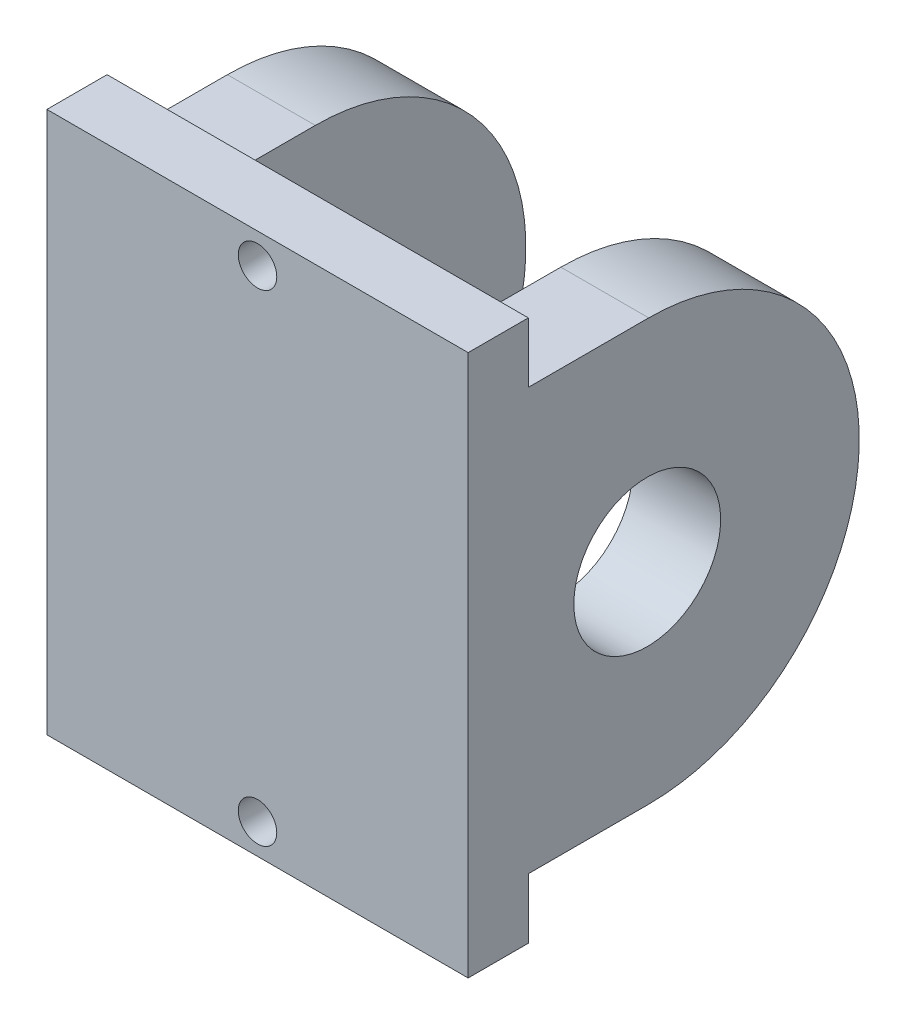
ISO-10303-21;
HEADER;
FILE_DESCRIPTION(('STEP AP214'),'2;1');
FILE_NAME('part.step','',(''),(''),'','','');
FILE_SCHEMA(('AUTOMOTIVE_DESIGN { 1 0 10303 214 1 1 1 1 }'));
ENDSEC;
DATA;
#1=APPLICATION_CONTEXT('core data for automotive mechanical design processes');
#2=APPLICATION_PROTOCOL_DEFINITION('international standard','automotive_design',2000,#1);
#3=PRODUCT_CONTEXT('',#1,'mechanical');
#4=PRODUCT('Part','Part','',(#3));
#5=PRODUCT_RELATED_PRODUCT_CATEGORY('part','',(#4));
#6=PRODUCT_DEFINITION_FORMATION('','',#4);
#7=PRODUCT_DEFINITION_CONTEXT('part definition',#1,'design');
#8=PRODUCT_DEFINITION('design','',#6,#7);
#9=PRODUCT_DEFINITION_SHAPE('','',#8);
#10=(LENGTH_UNIT() NAMED_UNIT(*) SI_UNIT(.MILLI.,.METRE.));
#11=(NAMED_UNIT(*) PLANE_ANGLE_UNIT() SI_UNIT($,.RADIAN.));
#12=(NAMED_UNIT(*) SI_UNIT($,.STERADIAN.) SOLID_ANGLE_UNIT());
#13=UNCERTAINTY_MEASURE_WITH_UNIT(LENGTH_MEASURE(1.E-05),#10,'distance_accuracy_value','');
#14=(GEOMETRIC_REPRESENTATION_CONTEXT(3) GLOBAL_UNCERTAINTY_ASSIGNED_CONTEXT((#13)) GLOBAL_UNIT_ASSIGNED_CONTEXT((#10,
#11,#12)) REPRESENTATION_CONTEXT('',''));
#15=CARTESIAN_POINT('',(0.,0.,0.));
#16=DIRECTION('',(0.,0.,1.));
#17=DIRECTION('',(1.,0.,0.));
#18=AXIS2_PLACEMENT_3D('',#15,#16,#17);
#19=CARTESIAN_POINT('',(-17.5,17.5,5.));
#20=DIRECTION('',(0.,-1.,0.));
#21=DIRECTION('',(0.,0.,-1.));
#22=AXIS2_PLACEMENT_3D('',#19,#20,#21);
#23=PLANE('',#22);
#24=DIRECTION('',(-1.,0.,0.));
#25=VECTOR('',#24,1.);
#26=CARTESIAN_POINT('',(-17.5,17.5,0.));
#27=LINE('',#26,#25);
#28=CARTESIAN_POINT('',(17.5,17.5,0.));
#29=VERTEX_POINT('',#28);
#30=CARTESIAN_POINT('',(10.2,17.5,0.));
#31=VERTEX_POINT('',#30);
#32=EDGE_CURVE('E214',#29,#31,#27,.T.);
#33=ORIENTED_EDGE('',*,*,#32,.F.);
#34=DIRECTION('',(0.,0.,-1.));
#35=VECTOR('',#34,1.);
#36=CARTESIAN_POINT('',(17.5,17.5,5.));
#37=LINE('',#36,#35);
#38=CARTESIAN_POINT('',(17.5,17.5,-10.));
#39=VERTEX_POINT('',#38);
#40=EDGE_CURVE('E51',#29,#39,#37,.T.);
#41=ORIENTED_EDGE('',*,*,#40,.T.);
#42=DIRECTION('',(1.,0.,0.));
#43=VECTOR('',#42,1.);
#44=CARTESIAN_POINT('',(10.2,17.5,-10.));
#45=LINE('',#44,#43);
#46=CARTESIAN_POINT('',(10.2,17.5,-10.));
#47=VERTEX_POINT('',#46);
#48=EDGE_CURVE('E240',#47,#39,#45,.T.);
#49=ORIENTED_EDGE('',*,*,#48,.F.);
#50=DIRECTION('',(0.,0.,1.));
#51=VECTOR('',#50,1.);
#52=CARTESIAN_POINT('',(10.2,17.5,-10.));
#53=LINE('',#52,#51);
#54=EDGE_CURVE('E230',#47,#31,#53,.T.);
#55=ORIENTED_EDGE('',*,*,#54,.T.);
#56=EDGE_LOOP('',(#33,#41,#49,#55));
#57=FACE_BOUND('',#56,.T.);
#58=ADVANCED_FACE('F41',(#57),#23,.F.);
#59=CARTESIAN_POINT('',(-10.2,17.5,0.));
#60=VERTEX_POINT('',#59);
#61=CARTESIAN_POINT('',(-17.5,17.5,0.));
#62=VERTEX_POINT('',#61);
#63=EDGE_CURVE('E217',#60,#62,#27,.T.);
#64=ORIENTED_EDGE('',*,*,#63,.F.);
#65=DIRECTION('',(0.,0.,-1.));
#66=VECTOR('',#65,1.);
#67=CARTESIAN_POINT('',(-10.2,17.5,5.));
#68=LINE('',#67,#66);
#69=CARTESIAN_POINT('',(-10.2,17.5,-10.));
#70=VERTEX_POINT('',#69);
#71=EDGE_CURVE('E90',#60,#70,#68,.T.);
#72=ORIENTED_EDGE('',*,*,#71,.T.);
#73=DIRECTION('',(-1.,0.,0.));
#74=VECTOR('',#73,1.);
#75=CARTESIAN_POINT('',(-10.2,17.5,-10.));
#76=LINE('',#75,#74);
#77=CARTESIAN_POINT('',(-17.5,17.5,-10.));
#78=VERTEX_POINT('',#77);
#79=EDGE_CURVE('E264',#70,#78,#76,.T.);
#80=ORIENTED_EDGE('',*,*,#79,.T.);
#81=DIRECTION('',(0.,0.,-1.));
#82=VECTOR('',#81,1.);
#83=CARTESIAN_POINT('',(-17.5,17.5,5.));
#84=LINE('',#83,#82);
#85=EDGE_CURVE('E284',#62,#78,#84,.T.);
#86=ORIENTED_EDGE('',*,*,#85,.F.);
#87=EDGE_LOOP('',(#64,#72,#80,#86));
#88=FACE_BOUND('',#87,.T.);
#89=ADVANCED_FACE('F335',(#88),#23,.F.);
#90=CARTESIAN_POINT('',(-17.5,-17.5,5.));
#91=DIRECTION('',(0.,1.,0.));
#92=DIRECTION('',(0.,0.,1.));
#93=AXIS2_PLACEMENT_3D('',#90,#91,#92);
#94=PLANE('',#93);
#95=DIRECTION('',(1.,0.,0.));
#96=VECTOR('',#95,1.);
#97=CARTESIAN_POINT('',(-17.5,-17.5,0.));
#98=LINE('',#97,#96);
#99=CARTESIAN_POINT('',(-17.5,-17.5,0.));
#100=VERTEX_POINT('',#99);
#101=CARTESIAN_POINT('',(-10.2,-17.5,0.));
#102=VERTEX_POINT('',#101);
#103=EDGE_CURVE('E213',#100,#102,#98,.T.);
#104=ORIENTED_EDGE('',*,*,#103,.F.);
#105=DIRECTION('',(0.,0.,-1.));
#106=VECTOR('',#105,1.);
#107=CARTESIAN_POINT('',(-17.5,-17.5,5.));
#108=LINE('',#107,#106);
#109=CARTESIAN_POINT('',(-17.5,-17.5,-10.));
#110=VERTEX_POINT('',#109);
#111=EDGE_CURVE('E83',#100,#110,#108,.T.);
#112=ORIENTED_EDGE('',*,*,#111,.T.);
#113=DIRECTION('',(-1.,0.,0.));
#114=VECTOR('',#113,1.);
#115=CARTESIAN_POINT('',(-10.2,-17.5,-10.));
#116=LINE('',#115,#114);
#117=CARTESIAN_POINT('',(-10.2,-17.5,-10.));
#118=VERTEX_POINT('',#117);
#119=EDGE_CURVE('E60',#118,#110,#116,.T.);
#120=ORIENTED_EDGE('',*,*,#119,.F.);
#121=DIRECTION('',(0.,0.,1.));
#122=VECTOR('',#121,1.);
#123=CARTESIAN_POINT('',(-10.2,-17.5,5.));
#124=LINE('',#123,#122);
#125=EDGE_CURVE('E262',#118,#102,#124,.T.);
#126=ORIENTED_EDGE('',*,*,#125,.T.);
#127=EDGE_LOOP('',(#104,#112,#120,#126));
#128=FACE_BOUND('',#127,.T.);
#129=ADVANCED_FACE('F324',(#128),#94,.F.);
#130=CARTESIAN_POINT('',(10.2,-17.5,0.));
#131=VERTEX_POINT('',#130);
#132=CARTESIAN_POINT('',(17.5,-17.5,0.));
#133=VERTEX_POINT('',#132);
#134=EDGE_CURVE('E207',#131,#133,#98,.T.);
#135=ORIENTED_EDGE('',*,*,#134,.F.);
#136=DIRECTION('',(0.,0.,-1.));
#137=VECTOR('',#136,1.);
#138=CARTESIAN_POINT('',(10.2,-17.5,5.));
#139=LINE('',#138,#137);
#140=CARTESIAN_POINT('',(10.2,-17.5,-10.));
#141=VERTEX_POINT('',#140);
#142=EDGE_CURVE('E218',#131,#141,#139,.T.);
#143=ORIENTED_EDGE('',*,*,#142,.T.);
#144=DIRECTION('',(1.,0.,0.));
#145=VECTOR('',#144,1.);
#146=CARTESIAN_POINT('',(10.2,-17.5,-10.));
#147=LINE('',#146,#145);
#148=CARTESIAN_POINT('',(17.5,-17.5,-10.));
#149=VERTEX_POINT('',#148);
#150=EDGE_CURVE('E233',#141,#149,#147,.T.);
#151=ORIENTED_EDGE('',*,*,#150,.T.);
#152=DIRECTION('',(0.,0.,-1.));
#153=VECTOR('',#152,1.);
#154=CARTESIAN_POINT('',(17.5,-17.5,5.));
#155=LINE('',#154,#153);
#156=EDGE_CURVE('E281',#133,#149,#155,.T.);
#157=ORIENTED_EDGE('',*,*,#156,.F.);
#158=EDGE_LOOP('',(#135,#143,#151,#157));
#159=FACE_BOUND('',#158,.T.);
#160=ADVANCED_FACE('F343',(#159),#94,.F.);
#161=CARTESIAN_POINT('',(0.,0.,0.));
#162=DIRECTION('',(0.,0.,1.));
#163=DIRECTION('',(1.,0.,0.));
#164=AXIS2_PLACEMENT_3D('',#161,#162,#163);
#165=PLANE('',#164);
#166=CARTESIAN_POINT('',(0.,20.,0.));
#167=DIRECTION('',(0.,0.,-1.));
#168=DIRECTION('',(-1.,0.,0.));
#169=AXIS2_PLACEMENT_3D('',#166,#167,#168);
#170=CIRCLE('',#169,1.6);
#171=CARTESIAN_POINT('',(-1.6,20.,0.));
#172=VERTEX_POINT('',#171);
#173=EDGE_CURVE('E288',#172,#172,#170,.T.);
#174=ORIENTED_EDGE('',*,*,#173,.F.);
#175=EDGE_LOOP('',(#174));
#176=FACE_BOUND('',#175,.T.);
#177=CARTESIAN_POINT('',(0.,-20.,0.));
#178=DIRECTION('',(0.,0.,-1.));
#179=DIRECTION('',(-1.,0.,0.));
#180=AXIS2_PLACEMENT_3D('',#177,#178,#179);
#181=CIRCLE('',#180,1.6);
#182=CARTESIAN_POINT('',(-1.6,-20.,0.));
#183=VERTEX_POINT('',#182);
#184=EDGE_CURVE('E294',#183,#183,#181,.T.);
#185=ORIENTED_EDGE('',*,*,#184,.F.);
#186=EDGE_LOOP('',(#185));
#187=FACE_BOUND('',#186,.T.);
#188=DIRECTION('',(0.,1.,0.));
#189=VECTOR('',#188,1.);
#190=CARTESIAN_POINT('',(10.2,0.,0.));
#191=LINE('',#190,#189);
#192=EDGE_CURVE('E243',#131,#31,#191,.T.);
#193=ORIENTED_EDGE('',*,*,#192,.F.);
#194=ORIENTED_EDGE('',*,*,#134,.T.);
#195=DIRECTION('',(0.,1.,0.));
#196=VECTOR('',#195,1.);
#197=CARTESIAN_POINT('',(17.5,22.5,0.));
#198=LINE('',#197,#196);
#199=CARTESIAN_POINT('',(17.5,-22.5,0.));
#200=VERTEX_POINT('',#199);
#201=EDGE_CURVE('E174',#200,#133,#198,.T.);
#202=ORIENTED_EDGE('',*,*,#201,.F.);
#203=DIRECTION('',(1.,0.,0.));
#204=VECTOR('',#203,1.);
#205=CARTESIAN_POINT('',(-17.5,-22.5,0.));
#206=LINE('',#205,#204);
#207=CARTESIAN_POINT('',(-17.5,-22.5,0.));
#208=VERTEX_POINT('',#207);
#209=EDGE_CURVE('E185',#208,#200,#206,.T.);
#210=ORIENTED_EDGE('',*,*,#209,.F.);
#211=DIRECTION('',(0.,-1.,0.));
#212=VECTOR('',#211,1.);
#213=CARTESIAN_POINT('',(-17.5,22.5,0.));
#214=LINE('',#213,#212);
#215=EDGE_CURVE('E192',#100,#208,#214,.T.);
#216=ORIENTED_EDGE('',*,*,#215,.F.);
#217=ORIENTED_EDGE('',*,*,#103,.T.);
#218=DIRECTION('',(0.,-1.,0.));
#219=VECTOR('',#218,1.);
#220=CARTESIAN_POINT('',(-10.2,0.,0.));
#221=LINE('',#220,#219);
#222=EDGE_CURVE('E11',#60,#102,#221,.T.);
#223=ORIENTED_EDGE('',*,*,#222,.F.);
#224=ORIENTED_EDGE('',*,*,#63,.T.);
#225=CARTESIAN_POINT('',(-17.5,22.5,0.));
#226=VERTEX_POINT('',#225);
#227=EDGE_CURVE('E191',#226,#62,#214,.T.);
#228=ORIENTED_EDGE('',*,*,#227,.F.);
#229=DIRECTION('',(-1.,0.,0.));
#230=VECTOR('',#229,1.);
#231=CARTESIAN_POINT('',(-17.5,22.5,0.));
#232=LINE('',#231,#230);
#233=CARTESIAN_POINT('',(17.5,22.5,0.));
#234=VERTEX_POINT('',#233);
#235=EDGE_CURVE('E181',#234,#226,#232,.T.);
#236=ORIENTED_EDGE('',*,*,#235,.F.);
#237=EDGE_CURVE('E166',#29,#234,#198,.T.);
#238=ORIENTED_EDGE('',*,*,#237,.F.);
#239=ORIENTED_EDGE('',*,*,#32,.T.);
#240=EDGE_LOOP('',(#193,#194,#202,#210,#216,#217,#223,#224,#228,#236,#238,#239));
#241=FACE_BOUND('',#240,.T.);
#242=ADVANCED_FACE('F189',(#176,#187,#241),#165,.F.);
#243=CARTESIAN_POINT('',(17.5,17.5,5.));
#244=DIRECTION('',(-1.,0.,0.));
#245=DIRECTION('',(0.,0.,1.));
#246=AXIS2_PLACEMENT_3D('',#243,#244,#245);
#247=PLANE('',#246);
#248=CARTESIAN_POINT('',(17.5,0.,-9.88054460705118));
#249=DIRECTION('',(-1.,0.,0.));
#250=DIRECTION('',(0.,0.,1.));
#251=AXIS2_PLACEMENT_3D('',#248,#249,#250);
#252=CIRCLE('',#251,6.1);
#253=CARTESIAN_POINT('',(17.5,0.,-3.78054460705118));
#254=VERTEX_POINT('',#253);
#255=EDGE_CURVE('E301',#254,#254,#252,.T.);
#256=ORIENTED_EDGE('',*,*,#255,.T.);
#257=EDGE_LOOP('',(#256));
#258=FACE_BOUND('',#257,.T.);
#259=DIRECTION('',(0.,1.,0.));
#260=VECTOR('',#259,1.);
#261=CARTESIAN_POINT('',(17.5,17.5,5.));
#262=LINE('',#261,#260);
#263=CARTESIAN_POINT('',(17.5,-22.5,5.));
#264=VERTEX_POINT('',#263);
#265=CARTESIAN_POINT('',(17.5,22.5,5.));
#266=VERTEX_POINT('',#265);
#267=EDGE_CURVE('E273',#264,#266,#262,.T.);
#268=ORIENTED_EDGE('',*,*,#267,.F.);
#269=DIRECTION('',(0.,0.,1.));
#270=VECTOR('',#269,1.);
#271=CARTESIAN_POINT('',(17.5,-22.5,0.));
#272=LINE('',#271,#270);
#273=EDGE_CURVE('E204',#200,#264,#272,.T.);
#274=ORIENTED_EDGE('',*,*,#273,.F.);
#275=ORIENTED_EDGE('',*,*,#201,.T.);
#276=ORIENTED_EDGE('',*,*,#156,.T.);
#277=DIRECTION('',(0.,1.,1.13766128465098E-12));
#278=VECTOR('',#277,1.);
#279=CARTESIAN_POINT('',(17.5,-17.5,-10.));
#280=LINE('',#279,#278);
#281=CARTESIAN_POINT('',(17.5,-17.4969503691487,-9.99999999999999));
#282=VERTEX_POINT('',#281);
#283=EDGE_CURVE('E216',#149,#282,#280,.T.);
#284=ORIENTED_EDGE('',*,*,#283,.T.);
#285=CARTESIAN_POINT('',(17.5,0.,-10.));
#286=DIRECTION('',(1.,0.,0.));
#287=DIRECTION('',(0.,0.,-1.));
#288=AXIS2_PLACEMENT_3D('',#285,#286,#287);
#289=CIRCLE('',#288,17.4969503691487);
#290=CARTESIAN_POINT('',(17.5,17.4969503691487,-10.));
#291=VERTEX_POINT('',#290);
#292=EDGE_CURVE('E236',#282,#291,#289,.T.);
#293=ORIENTED_EDGE('',*,*,#292,.T.);
#294=DIRECTION('',(0.,1.,0.));
#295=VECTOR('',#294,1.);
#296=CARTESIAN_POINT('',(17.5,17.4969503691487,-10.));
#297=LINE('',#296,#295);
#298=EDGE_CURVE('E221',#291,#39,#297,.T.);
#299=ORIENTED_EDGE('',*,*,#298,.T.);
#300=ORIENTED_EDGE('',*,*,#40,.F.);
#301=ORIENTED_EDGE('',*,*,#237,.T.);
#302=DIRECTION('',(0.,0.,1.));
#303=VECTOR('',#302,1.);
#304=CARTESIAN_POINT('',(17.5,22.5,0.));
#305=LINE('',#304,#303);
#306=EDGE_CURVE('E168',#234,#266,#305,.T.);
#307=ORIENTED_EDGE('',*,*,#306,.T.);
#308=EDGE_LOOP('',(#268,#274,#275,#276,#284,#293,#299,#300,#301,#307));
#309=FACE_BOUND('',#308,.T.);
#310=ADVANCED_FACE('F43',(#258,#309),#247,.F.);
#311=CARTESIAN_POINT('',(-17.5,17.5,5.));
#312=DIRECTION('',(1.,0.,0.));
#313=DIRECTION('',(0.,0.,-1.));
#314=AXIS2_PLACEMENT_3D('',#311,#312,#313);
#315=PLANE('',#314);
#316=CARTESIAN_POINT('',(-17.5,0.,-9.88054460705118));
#317=DIRECTION('',(1.,0.,0.));
#318=DIRECTION('',(0.,0.,-1.));
#319=AXIS2_PLACEMENT_3D('',#316,#317,#318);
#320=CIRCLE('',#319,6.1);
#321=CARTESIAN_POINT('',(-17.5,0.,-15.9805446070512));
#322=VERTEX_POINT('',#321);
#323=EDGE_CURVE('E201',#322,#322,#320,.T.);
#324=ORIENTED_EDGE('',*,*,#323,.T.);
#325=EDGE_LOOP('',(#324));
#326=FACE_BOUND('',#325,.T.);
#327=DIRECTION('',(0.,-1.,0.));
#328=VECTOR('',#327,1.);
#329=CARTESIAN_POINT('',(-17.5,17.5,5.));
#330=LINE('',#329,#328);
#331=CARTESIAN_POINT('',(-17.5,22.5,5.));
#332=VERTEX_POINT('',#331);
#333=CARTESIAN_POINT('',(-17.5,-22.5,5.));
#334=VERTEX_POINT('',#333);
#335=EDGE_CURVE('E279',#332,#334,#330,.T.);
#336=ORIENTED_EDGE('',*,*,#335,.F.);
#337=DIRECTION('',(0.,0.,1.));
#338=VECTOR('',#337,1.);
#339=CARTESIAN_POINT('',(-17.5,22.5,0.));
#340=LINE('',#339,#338);
#341=EDGE_CURVE('E184',#226,#332,#340,.T.);
#342=ORIENTED_EDGE('',*,*,#341,.F.);
#343=ORIENTED_EDGE('',*,*,#227,.T.);
#344=ORIENTED_EDGE('',*,*,#85,.T.);
#345=DIRECTION('',(0.,-1.,0.));
#346=VECTOR('',#345,1.);
#347=CARTESIAN_POINT('',(-17.5,17.5,-10.));
#348=LINE('',#347,#346);
#349=CARTESIAN_POINT('',(-17.5,17.4969503691487,-10.));
#350=VERTEX_POINT('',#349);
#351=EDGE_CURVE('E252',#78,#350,#348,.T.);
#352=ORIENTED_EDGE('',*,*,#351,.T.);
#353=CARTESIAN_POINT('',(-17.5,0.,-10.));
#354=DIRECTION('',(-1.,0.,0.));
#355=DIRECTION('',(0.,0.,1.));
#356=AXIS2_PLACEMENT_3D('',#353,#354,#355);
#357=CIRCLE('',#356,17.4969503691487);
#358=CARTESIAN_POINT('',(-17.5,-17.4969503691487,-10.));
#359=VERTEX_POINT('',#358);
#360=EDGE_CURVE('E267',#350,#359,#357,.T.);
#361=ORIENTED_EDGE('',*,*,#360,.T.);
#362=DIRECTION('',(0.,-1.,-5.68830642325492E-13));
#363=VECTOR('',#362,1.);
#364=CARTESIAN_POINT('',(-17.5,-17.4969503691487,-10.));
#365=LINE('',#364,#363);
#366=EDGE_CURVE('E255',#359,#110,#365,.T.);
#367=ORIENTED_EDGE('',*,*,#366,.T.);
#368=ORIENTED_EDGE('',*,*,#111,.F.);
#369=ORIENTED_EDGE('',*,*,#215,.T.);
#370=DIRECTION('',(0.,0.,1.));
#371=VECTOR('',#370,1.);
#372=CARTESIAN_POINT('',(-17.5,-22.5,0.));
#373=LINE('',#372,#371);
#374=EDGE_CURVE('E208',#208,#334,#373,.T.);
#375=ORIENTED_EDGE('',*,*,#374,.T.);
#376=EDGE_LOOP('',(#336,#342,#343,#344,#352,#361,#367,#368,#369,#375));
#377=FACE_BOUND('',#376,.T.);
#378=ADVANCED_FACE('F326',(#326,#377),#315,.F.);
#379=CARTESIAN_POINT('',(0.,0.,5.));
#380=DIRECTION('',(0.,0.,1.));
#381=DIRECTION('',(1.,0.,0.));
#382=AXIS2_PLACEMENT_3D('',#379,#380,#381);
#383=PLANE('',#382);
#384=CARTESIAN_POINT('',(0.,20.,5.));
#385=DIRECTION('',(0.,0.,1.));
#386=DIRECTION('',(1.,0.,0.));
#387=AXIS2_PLACEMENT_3D('',#384,#385,#386);
#388=CIRCLE('',#387,1.6);
#389=CARTESIAN_POINT('',(1.6,20.,5.));
#390=VERTEX_POINT('',#389);
#391=EDGE_CURVE('E45',#390,#390,#388,.T.);
#392=ORIENTED_EDGE('',*,*,#391,.F.);
#393=EDGE_LOOP('',(#392));
#394=FACE_BOUND('',#393,.T.);
#395=CARTESIAN_POINT('',(0.,-20.,5.));
#396=DIRECTION('',(0.,0.,1.));
#397=DIRECTION('',(1.,0.,0.));
#398=AXIS2_PLACEMENT_3D('',#395,#396,#397);
#399=CIRCLE('',#398,1.6);
#400=CARTESIAN_POINT('',(1.6,-20.,5.));
#401=VERTEX_POINT('',#400);
#402=EDGE_CURVE('E286',#401,#401,#399,.T.);
#403=ORIENTED_EDGE('',*,*,#402,.F.);
#404=EDGE_LOOP('',(#403));
#405=FACE_BOUND('',#404,.T.);
#406=ORIENTED_EDGE('',*,*,#267,.T.);
#407=DIRECTION('',(-1.,0.,0.));
#408=VECTOR('',#407,1.);
#409=CARTESIAN_POINT('',(-17.5,22.5,5.));
#410=LINE('',#409,#408);
#411=EDGE_CURVE('E183',#266,#332,#410,.T.);
#412=ORIENTED_EDGE('',*,*,#411,.T.);
#413=ORIENTED_EDGE('',*,*,#335,.T.);
#414=DIRECTION('',(1.,0.,0.));
#415=VECTOR('',#414,1.);
#416=CARTESIAN_POINT('',(-17.5,-22.5,5.));
#417=LINE('',#416,#415);
#418=EDGE_CURVE('E175',#334,#264,#417,.T.);
#419=ORIENTED_EDGE('',*,*,#418,.T.);
#420=EDGE_LOOP('',(#406,#412,#413,#419));
#421=FACE_BOUND('',#420,.T.);
#422=ADVANCED_FACE('F317',(#394,#405,#421),#383,.T.);
#423=CARTESIAN_POINT('',(-10.2,0.,-10.));
#424=DIRECTION('',(-1.,0.,0.));
#425=DIRECTION('',(0.,0.,1.));
#426=AXIS2_PLACEMENT_3D('',#423,#424,#425);
#427=PLANE('',#426);
#428=CARTESIAN_POINT('',(-10.2,0.,-9.88054460705118));
#429=DIRECTION('',(1.,0.,0.));
#430=DIRECTION('',(0.,0.,-1.));
#431=AXIS2_PLACEMENT_3D('',#428,#429,#430);
#432=CIRCLE('',#431,6.1);
#433=CARTESIAN_POINT('',(-10.2,0.,-15.9805446070512));
#434=VERTEX_POINT('',#433);
#435=EDGE_CURVE('E304',#434,#434,#432,.T.);
#436=ORIENTED_EDGE('',*,*,#435,.F.);
#437=EDGE_LOOP('',(#436));
#438=FACE_BOUND('',#437,.T.);
#439=ORIENTED_EDGE('',*,*,#71,.F.);
#440=ORIENTED_EDGE('',*,*,#222,.T.);
#441=ORIENTED_EDGE('',*,*,#125,.F.);
#442=DIRECTION('',(0.,-1.,-5.68830642325492E-13));
#443=VECTOR('',#442,1.);
#444=CARTESIAN_POINT('',(-10.2,-17.4969503691487,-10.));
#445=LINE('',#444,#443);
#446=CARTESIAN_POINT('',(-10.2,-17.4969503691487,-10.));
#447=VERTEX_POINT('',#446);
#448=EDGE_CURVE('E260',#447,#118,#445,.T.);
#449=ORIENTED_EDGE('',*,*,#448,.F.);
#450=CARTESIAN_POINT('',(-10.2,0.,-10.));
#451=DIRECTION('',(-1.,0.,0.));
#452=DIRECTION('',(0.,0.,1.));
#453=AXIS2_PLACEMENT_3D('',#450,#451,#452);
#454=CIRCLE('',#453,17.4969503691487);
#455=CARTESIAN_POINT('',(-10.2,17.4969503691487,-10.));
#456=VERTEX_POINT('',#455);
#457=EDGE_CURVE('E258',#456,#447,#454,.T.);
#458=ORIENTED_EDGE('',*,*,#457,.F.);
#459=DIRECTION('',(0.,-1.,0.));
#460=VECTOR('',#459,1.);
#461=CARTESIAN_POINT('',(-10.2,17.5,-10.));
#462=LINE('',#461,#460);
#463=EDGE_CURVE('E254',#70,#456,#462,.T.);
#464=ORIENTED_EDGE('',*,*,#463,.F.);
#465=EDGE_LOOP('',(#439,#440,#441,#449,#458,#464));
#466=FACE_BOUND('',#465,.T.);
#467=ADVANCED_FACE('F313',(#438,#466),#427,.F.);
#468=CARTESIAN_POINT('',(-10.2,-17.4969503691487,-10.));
#469=DIRECTION('',(0.,5.68830642325492E-13,-1.));
#470=DIRECTION('',(0.,1.,5.68830642325492E-13));
#471=AXIS2_PLACEMENT_3D('',#468,#469,#470);
#472=PLANE('',#471);
#473=ORIENTED_EDGE('',*,*,#366,.F.);
#474=DIRECTION('',(-1.,0.,0.));
#475=VECTOR('',#474,1.);
#476=CARTESIAN_POINT('',(-10.2,-17.4969503691487,-10.));
#477=LINE('',#476,#475);
#478=EDGE_CURVE('E78',#447,#359,#477,.T.);
#479=ORIENTED_EDGE('',*,*,#478,.F.);
#480=ORIENTED_EDGE('',*,*,#448,.T.);
#481=ORIENTED_EDGE('',*,*,#119,.T.);
#482=EDGE_LOOP('',(#473,#479,#480,#481));
#483=FACE_BOUND('',#482,.T.);
#484=ADVANCED_FACE('F316',(#483),#472,.T.);
#485=CARTESIAN_POINT('',(-10.2,0.,-10.));
#486=DIRECTION('',(-1.,0.,0.));
#487=DIRECTION('',(0.,0.,1.));
#488=AXIS2_PLACEMENT_3D('',#485,#486,#487);
#489=CYLINDRICAL_SURFACE('',#488,17.4969503691487);
#490=ORIENTED_EDGE('',*,*,#360,.F.);
#491=DIRECTION('',(-1.,0.,0.));
#492=VECTOR('',#491,1.);
#493=CARTESIAN_POINT('',(-10.2,17.4969503691487,-10.));
#494=LINE('',#493,#492);
#495=EDGE_CURVE('E275',#456,#350,#494,.T.);
#496=ORIENTED_EDGE('',*,*,#495,.F.);
#497=ORIENTED_EDGE('',*,*,#457,.T.);
#498=ORIENTED_EDGE('',*,*,#478,.T.);
#499=EDGE_LOOP('',(#490,#496,#497,#498));
#500=FACE_BOUND('',#499,.T.);
#501=ADVANCED_FACE('F330',(#500),#489,.T.);
#502=CARTESIAN_POINT('',(-10.2,17.5,-10.));
#503=DIRECTION('',(0.,0.,-1.));
#504=DIRECTION('',(-1.,0.,0.));
#505=AXIS2_PLACEMENT_3D('',#502,#503,#504);
#506=PLANE('',#505);
#507=ORIENTED_EDGE('',*,*,#351,.F.);
#508=ORIENTED_EDGE('',*,*,#79,.F.);
#509=ORIENTED_EDGE('',*,*,#463,.T.);
#510=ORIENTED_EDGE('',*,*,#495,.T.);
#511=EDGE_LOOP('',(#507,#508,#509,#510));
#512=FACE_BOUND('',#511,.T.);
#513=ADVANCED_FACE('F333',(#512),#506,.T.);
#514=CARTESIAN_POINT('',(10.2,0.,-10.));
#515=DIRECTION('',(1.,0.,0.));
#516=DIRECTION('',(0.,0.,-1.));
#517=AXIS2_PLACEMENT_3D('',#514,#515,#516);
#518=PLANE('',#517);
#519=CARTESIAN_POINT('',(10.2,0.,-9.88054460705118));
#520=DIRECTION('',(-1.,0.,0.));
#521=DIRECTION('',(0.,0.,1.));
#522=AXIS2_PLACEMENT_3D('',#519,#520,#521);
#523=CIRCLE('',#522,6.1);
#524=CARTESIAN_POINT('',(10.2,0.,-3.78054460705118));
#525=VERTEX_POINT('',#524);
#526=EDGE_CURVE('E292',#525,#525,#523,.T.);
#527=ORIENTED_EDGE('',*,*,#526,.F.);
#528=EDGE_LOOP('',(#527));
#529=FACE_BOUND('',#528,.T.);
#530=ORIENTED_EDGE('',*,*,#142,.F.);
#531=ORIENTED_EDGE('',*,*,#192,.T.);
#532=ORIENTED_EDGE('',*,*,#54,.F.);
#533=DIRECTION('',(0.,1.,0.));
#534=VECTOR('',#533,1.);
#535=CARTESIAN_POINT('',(10.2,17.4969503691487,-10.));
#536=LINE('',#535,#534);
#537=CARTESIAN_POINT('',(10.2,17.4969503691487,-10.));
#538=VERTEX_POINT('',#537);
#539=EDGE_CURVE('E227',#538,#47,#536,.T.);
#540=ORIENTED_EDGE('',*,*,#539,.F.);
#541=CARTESIAN_POINT('',(10.2,0.,-10.));
#542=DIRECTION('',(1.,0.,0.));
#543=DIRECTION('',(0.,0.,-1.));
#544=AXIS2_PLACEMENT_3D('',#541,#542,#543);
#545=CIRCLE('',#544,17.4969503691487);
#546=CARTESIAN_POINT('',(10.2,-17.4969503691487,-9.99999999999999));
#547=VERTEX_POINT('',#546);
#548=EDGE_CURVE('E224',#547,#538,#545,.T.);
#549=ORIENTED_EDGE('',*,*,#548,.F.);
#550=DIRECTION('',(0.,1.,1.13766128465098E-12));
#551=VECTOR('',#550,1.);
#552=CARTESIAN_POINT('',(10.2,-17.5,-10.));
#553=LINE('',#552,#551);
#554=EDGE_CURVE('E220',#141,#547,#553,.T.);
#555=ORIENTED_EDGE('',*,*,#554,.F.);
#556=EDGE_LOOP('',(#530,#531,#532,#540,#549,#555));
#557=FACE_BOUND('',#556,.T.);
#558=ADVANCED_FACE('F361',(#529,#557),#518,.F.);
#559=CARTESIAN_POINT('',(10.2,17.4969503691487,-10.));
#560=DIRECTION('',(0.,0.,-1.));
#561=DIRECTION('',(-1.,0.,0.));
#562=AXIS2_PLACEMENT_3D('',#559,#560,#561);
#563=PLANE('',#562);
#564=ORIENTED_EDGE('',*,*,#298,.F.);
#565=DIRECTION('',(1.,0.,0.));
#566=VECTOR('',#565,1.);
#567=CARTESIAN_POINT('',(10.2,17.4969503691487,-10.));
#568=LINE('',#567,#566);
#569=EDGE_CURVE('E244',#538,#291,#568,.T.);
#570=ORIENTED_EDGE('',*,*,#569,.F.);
#571=ORIENTED_EDGE('',*,*,#539,.T.);
#572=ORIENTED_EDGE('',*,*,#48,.T.);
#573=EDGE_LOOP('',(#564,#570,#571,#572));
#574=FACE_BOUND('',#573,.T.);
#575=ADVANCED_FACE('F357',(#574),#563,.T.);
#576=CARTESIAN_POINT('',(10.2,0.,-10.));
#577=DIRECTION('',(1.,0.,0.));
#578=DIRECTION('',(0.,0.,-1.));
#579=AXIS2_PLACEMENT_3D('',#576,#577,#578);
#580=CYLINDRICAL_SURFACE('',#579,17.4969503691487);
#581=ORIENTED_EDGE('',*,*,#292,.F.);
#582=DIRECTION('',(1.,0.,0.));
#583=VECTOR('',#582,1.);
#584=CARTESIAN_POINT('',(10.2,-17.4969503691487,-9.99999999999999));
#585=LINE('',#584,#583);
#586=EDGE_CURVE('E246',#547,#282,#585,.T.);
#587=ORIENTED_EDGE('',*,*,#586,.F.);
#588=ORIENTED_EDGE('',*,*,#548,.T.);
#589=ORIENTED_EDGE('',*,*,#569,.T.);
#590=EDGE_LOOP('',(#581,#587,#588,#589));
#591=FACE_BOUND('',#590,.T.);
#592=ADVANCED_FACE('F353',(#591),#580,.T.);
#593=CARTESIAN_POINT('',(10.2,-17.5,-10.));
#594=DIRECTION('',(0.,1.13766128465098E-12,-1.));
#595=DIRECTION('',(0.,1.,1.13766128465098E-12));
#596=AXIS2_PLACEMENT_3D('',#593,#594,#595);
#597=PLANE('',#596);
#598=ORIENTED_EDGE('',*,*,#283,.F.);
#599=ORIENTED_EDGE('',*,*,#150,.F.);
#600=ORIENTED_EDGE('',*,*,#554,.T.);
#601=ORIENTED_EDGE('',*,*,#586,.T.);
#602=EDGE_LOOP('',(#598,#599,#600,#601));
#603=FACE_BOUND('',#602,.T.);
#604=ADVANCED_FACE('F349',(#603),#597,.T.);
#605=CARTESIAN_POINT('',(-17.5,-22.5,0.));
#606=DIRECTION('',(0.,-1.,0.));
#607=DIRECTION('',(0.,0.,-1.));
#608=AXIS2_PLACEMENT_3D('',#605,#606,#607);
#609=PLANE('',#608);
#610=ORIENTED_EDGE('',*,*,#418,.F.);
#611=ORIENTED_EDGE('',*,*,#374,.F.);
#612=ORIENTED_EDGE('',*,*,#209,.T.);
#613=ORIENTED_EDGE('',*,*,#273,.T.);
#614=EDGE_LOOP('',(#610,#611,#612,#613));
#615=FACE_BOUND('',#614,.T.);
#616=ADVANCED_FACE('F340',(#615),#609,.T.);
#617=CARTESIAN_POINT('',(-17.5,22.5,0.));
#618=DIRECTION('',(0.,1.,0.));
#619=DIRECTION('',(0.,0.,1.));
#620=AXIS2_PLACEMENT_3D('',#617,#618,#619);
#621=PLANE('',#620);
#622=ORIENTED_EDGE('',*,*,#411,.F.);
#623=ORIENTED_EDGE('',*,*,#306,.F.);
#624=ORIENTED_EDGE('',*,*,#235,.T.);
#625=ORIENTED_EDGE('',*,*,#341,.T.);
#626=EDGE_LOOP('',(#622,#623,#624,#625));
#627=FACE_BOUND('',#626,.T.);
#628=ADVANCED_FACE('F179',(#627),#621,.T.);
#629=CARTESIAN_POINT('',(-17.5,0.,-9.88054460705118));
#630=DIRECTION('',(1.,0.,0.));
#631=DIRECTION('',(0.,0.,-1.));
#632=AXIS2_PLACEMENT_3D('',#629,#630,#631);
#633=CYLINDRICAL_SURFACE('',#632,6.1);
#634=CARTESIAN_POINT('',(-17.5,0.,-15.9805446070512));
#635=CARTESIAN_POINT('',(-17.4239583333333,0.,-15.9805446070512));
#636=CARTESIAN_POINT('',(-17.3479166666667,0.,-15.9805446070512));
#637=CARTESIAN_POINT('',(-17.1958333333333,0.,-15.9805446070512));
#638=CARTESIAN_POINT('',(-17.1197916666667,0.,-15.9805446070512));
#639=CARTESIAN_POINT('',(-16.9677083333333,0.,-15.9805446070512));
#640=CARTESIAN_POINT('',(-16.8916666666667,0.,-15.9805446070512));
#641=CARTESIAN_POINT('',(-16.7395833333333,0.,-15.9805446070512));
#642=CARTESIAN_POINT('',(-16.6635416666667,0.,-15.9805446070512));
#643=CARTESIAN_POINT('',(-16.5114583333333,0.,-15.9805446070512));
#644=CARTESIAN_POINT('',(-16.4354166666667,0.,-15.9805446070512));
#645=CARTESIAN_POINT('',(-16.2833333333333,0.,-15.9805446070512));
#646=CARTESIAN_POINT('',(-16.2072916666667,0.,-15.9805446070512));
#647=CARTESIAN_POINT('',(-16.0552083333333,0.,-15.9805446070512));
#648=CARTESIAN_POINT('',(-15.9791666666667,0.,-15.9805446070512));
#649=CARTESIAN_POINT('',(-15.8270833333333,0.,-15.9805446070512));
#650=CARTESIAN_POINT('',(-15.7510416666667,0.,-15.9805446070512));
#651=CARTESIAN_POINT('',(-15.5989583333333,0.,-15.9805446070512));
#652=CARTESIAN_POINT('',(-15.5229166666667,0.,-15.9805446070512));
#653=CARTESIAN_POINT('',(-15.3708333333333,0.,-15.9805446070512));
#654=CARTESIAN_POINT('',(-15.2947916666667,0.,-15.9805446070512));
#655=CARTESIAN_POINT('',(-15.1427083333333,0.,-15.9805446070512));
#656=CARTESIAN_POINT('',(-15.0666666666667,0.,-15.9805446070512));
#657=CARTESIAN_POINT('',(-14.9145833333333,0.,-15.9805446070512));
#658=CARTESIAN_POINT('',(-14.8385416666667,0.,-15.9805446070512));
#659=CARTESIAN_POINT('',(-14.6864583333333,0.,-15.9805446070512));
#660=CARTESIAN_POINT('',(-14.6104166666667,0.,-15.9805446070512));
#661=CARTESIAN_POINT('',(-14.4583333333333,0.,-15.9805446070512));
#662=CARTESIAN_POINT('',(-14.3822916666667,0.,-15.9805446070512));
#663=CARTESIAN_POINT('',(-14.2302083333333,0.,-15.9805446070512));
#664=CARTESIAN_POINT('',(-14.1541666666667,0.,-15.9805446070512));
#665=CARTESIAN_POINT('',(-14.0020833333333,0.,-15.9805446070512));
#666=CARTESIAN_POINT('',(-13.9260416666667,0.,-15.9805446070512));
#667=CARTESIAN_POINT('',(-13.7739583333333,0.,-15.9805446070512));
#668=CARTESIAN_POINT('',(-13.6979166666667,0.,-15.9805446070512));
#669=CARTESIAN_POINT('',(-13.5458333333333,0.,-15.9805446070512));
#670=CARTESIAN_POINT('',(-13.4697916666667,0.,-15.9805446070512));
#671=CARTESIAN_POINT('',(-13.3177083333333,0.,-15.9805446070512));
#672=CARTESIAN_POINT('',(-13.2416666666667,0.,-15.9805446070512));
#673=CARTESIAN_POINT('',(-13.0895833333333,0.,-15.9805446070512));
#674=CARTESIAN_POINT('',(-13.0135416666667,0.,-15.9805446070512));
#675=CARTESIAN_POINT('',(-12.8614583333333,0.,-15.9805446070512));
#676=CARTESIAN_POINT('',(-12.7854166666667,0.,-15.9805446070512));
#677=CARTESIAN_POINT('',(-12.6333333333333,0.,-15.9805446070512));
#678=CARTESIAN_POINT('',(-12.5572916666667,0.,-15.9805446070512));
#679=CARTESIAN_POINT('',(-12.4052083333333,0.,-15.9805446070512));
#680=CARTESIAN_POINT('',(-12.3291666666667,0.,-15.9805446070512));
#681=CARTESIAN_POINT('',(-12.1770833333333,0.,-15.9805446070512));
#682=CARTESIAN_POINT('',(-12.1010416666667,0.,-15.9805446070512));
#683=CARTESIAN_POINT('',(-11.9489583333333,0.,-15.9805446070512));
#684=CARTESIAN_POINT('',(-11.8729166666667,0.,-15.9805446070512));
#685=CARTESIAN_POINT('',(-11.7208333333333,0.,-15.9805446070512));
#686=CARTESIAN_POINT('',(-11.6447916666667,0.,-15.9805446070512));
#687=CARTESIAN_POINT('',(-11.4927083333333,0.,-15.9805446070512));
#688=CARTESIAN_POINT('',(-11.4166666666667,0.,-15.9805446070512));
#689=CARTESIAN_POINT('',(-11.2645833333333,0.,-15.9805446070512));
#690=CARTESIAN_POINT('',(-11.1885416666667,0.,-15.9805446070512));
#691=CARTESIAN_POINT('',(-11.0364583333333,0.,-15.9805446070512));
#692=CARTESIAN_POINT('',(-10.9604166666667,0.,-15.9805446070512));
#693=CARTESIAN_POINT('',(-10.8083333333333,0.,-15.9805446070512));
#694=CARTESIAN_POINT('',(-10.7322916666667,0.,-15.9805446070512));
#695=CARTESIAN_POINT('',(-10.5802083333333,0.,-15.9805446070512));
#696=CARTESIAN_POINT('',(-10.5041666666667,0.,-15.9805446070512));
#697=CARTESIAN_POINT('',(-10.3520833333333,0.,-15.9805446070512));
#698=CARTESIAN_POINT('',(-10.2760416666667,0.,-15.9805446070512));
#699=CARTESIAN_POINT('',(-10.2,0.,-15.9805446070512));
#700=B_SPLINE_CURVE_WITH_KNOTS('',3,(#634,#635,#636,#637,#638,#639,#640,#641,#642,#643,#644,
#645,#646,#647,#648,#649,#650,#651,#652,#653,#654,#655,#656,#657,#658,#659,#660,#661,#662,#663,
#664,#665,#666,#667,#668,#669,#670,#671,#672,#673,#674,#675,#676,#677,#678,#679,#680,#681,#682,
#683,#684,#685,#686,#687,#688,#689,#690,#691,#692,#693,#694,#695,#696,#697,#698,#699),
.UNSPECIFIED.,.F.,.F.,(4,2,2,2,2,2,2,2,2,2,2,2,2,2,2,2,2,2,2,2,2,2,2,2,2,2,2,2,2,2,2,2,4),(0.,
0.228124999999999,0.456249999999998,0.684374999999998,0.9125,1.140625,1.36875,1.596875,1.825,
2.053125,2.28125,2.509375,2.7375,2.965625,3.19375,3.421875,3.65,3.878125,4.10625,4.334375,
4.5625,4.790625,5.01875,5.246875,5.475,5.703125,5.93125,6.159375,6.3875,6.615625,6.84375,
7.071875,7.3),.UNSPECIFIED.);
#701=EDGE_CURVE('BSEAM311',#322,#434,#700,.T.);
#702=ORIENTED_EDGE('',*,*,#323,.F.);
#703=ORIENTED_EDGE('',*,*,#435,.T.);
#704=ORIENTED_EDGE('',*,*,#701,.T.);
#705=ORIENTED_EDGE('',*,*,#701,.F.);
#706=EDGE_LOOP('',(#702,#704,#703,#705));
#707=FACE_BOUND('',#706,.T.);
#708=ADVANCED_FACE('F311',(#707),#633,.F.);
#709=CARTESIAN_POINT('',(17.5,0.,-9.88054460705118));
#710=DIRECTION('',(-1.,0.,0.));
#711=DIRECTION('',(0.,0.,1.));
#712=AXIS2_PLACEMENT_3D('',#709,#710,#711);
#713=CYLINDRICAL_SURFACE('',#712,6.1);
#714=CARTESIAN_POINT('',(17.5,0.,-3.78054460705118));
#715=CARTESIAN_POINT('',(17.4239583333333,0.,-3.78054460705118));
#716=CARTESIAN_POINT('',(17.3479166666667,0.,-3.78054460705118));
#717=CARTESIAN_POINT('',(17.1958333333333,0.,-3.78054460705118));
#718=CARTESIAN_POINT('',(17.1197916666667,0.,-3.78054460705118));
#719=CARTESIAN_POINT('',(16.9677083333333,0.,-3.78054460705118));
#720=CARTESIAN_POINT('',(16.8916666666667,0.,-3.78054460705118));
#721=CARTESIAN_POINT('',(16.7395833333333,0.,-3.78054460705118));
#722=CARTESIAN_POINT('',(16.6635416666667,0.,-3.78054460705118));
#723=CARTESIAN_POINT('',(16.5114583333333,0.,-3.78054460705118));
#724=CARTESIAN_POINT('',(16.4354166666667,0.,-3.78054460705118));
#725=CARTESIAN_POINT('',(16.2833333333333,0.,-3.78054460705118));
#726=CARTESIAN_POINT('',(16.2072916666667,0.,-3.78054460705118));
#727=CARTESIAN_POINT('',(16.0552083333333,0.,-3.78054460705118));
#728=CARTESIAN_POINT('',(15.9791666666667,0.,-3.78054460705118));
#729=CARTESIAN_POINT('',(15.8270833333333,0.,-3.78054460705118));
#730=CARTESIAN_POINT('',(15.7510416666667,0.,-3.78054460705118));
#731=CARTESIAN_POINT('',(15.5989583333333,0.,-3.78054460705118));
#732=CARTESIAN_POINT('',(15.5229166666667,0.,-3.78054460705118));
#733=CARTESIAN_POINT('',(15.3708333333333,0.,-3.78054460705118));
#734=CARTESIAN_POINT('',(15.2947916666667,0.,-3.78054460705118));
#735=CARTESIAN_POINT('',(15.1427083333333,0.,-3.78054460705118));
#736=CARTESIAN_POINT('',(15.0666666666667,0.,-3.78054460705118));
#737=CARTESIAN_POINT('',(14.9145833333333,0.,-3.78054460705118));
#738=CARTESIAN_POINT('',(14.8385416666667,0.,-3.78054460705118));
#739=CARTESIAN_POINT('',(14.6864583333333,0.,-3.78054460705118));
#740=CARTESIAN_POINT('',(14.6104166666667,0.,-3.78054460705118));
#741=CARTESIAN_POINT('',(14.4583333333333,0.,-3.78054460705118));
#742=CARTESIAN_POINT('',(14.3822916666667,0.,-3.78054460705118));
#743=CARTESIAN_POINT('',(14.2302083333333,0.,-3.78054460705118));
#744=CARTESIAN_POINT('',(14.1541666666667,0.,-3.78054460705118));
#745=CARTESIAN_POINT('',(14.0020833333333,0.,-3.78054460705118));
#746=CARTESIAN_POINT('',(13.9260416666667,0.,-3.78054460705118));
#747=CARTESIAN_POINT('',(13.7739583333333,0.,-3.78054460705118));
#748=CARTESIAN_POINT('',(13.6979166666667,0.,-3.78054460705118));
#749=CARTESIAN_POINT('',(13.5458333333333,0.,-3.78054460705118));
#750=CARTESIAN_POINT('',(13.4697916666667,0.,-3.78054460705118));
#751=CARTESIAN_POINT('',(13.3177083333333,0.,-3.78054460705118));
#752=CARTESIAN_POINT('',(13.2416666666667,0.,-3.78054460705118));
#753=CARTESIAN_POINT('',(13.0895833333333,0.,-3.78054460705118));
#754=CARTESIAN_POINT('',(13.0135416666667,0.,-3.78054460705118));
#755=CARTESIAN_POINT('',(12.8614583333333,0.,-3.78054460705118));
#756=CARTESIAN_POINT('',(12.7854166666667,0.,-3.78054460705118));
#757=CARTESIAN_POINT('',(12.6333333333333,0.,-3.78054460705118));
#758=CARTESIAN_POINT('',(12.5572916666667,0.,-3.78054460705118));
#759=CARTESIAN_POINT('',(12.4052083333333,0.,-3.78054460705118));
#760=CARTESIAN_POINT('',(12.3291666666667,0.,-3.78054460705118));
#761=CARTESIAN_POINT('',(12.1770833333333,0.,-3.78054460705118));
#762=CARTESIAN_POINT('',(12.1010416666667,0.,-3.78054460705118));
#763=CARTESIAN_POINT('',(11.9489583333333,0.,-3.78054460705118));
#764=CARTESIAN_POINT('',(11.8729166666667,0.,-3.78054460705118));
#765=CARTESIAN_POINT('',(11.7208333333333,0.,-3.78054460705118));
#766=CARTESIAN_POINT('',(11.6447916666667,0.,-3.78054460705118));
#767=CARTESIAN_POINT('',(11.4927083333333,0.,-3.78054460705118));
#768=CARTESIAN_POINT('',(11.4166666666667,0.,-3.78054460705118));
#769=CARTESIAN_POINT('',(11.2645833333333,0.,-3.78054460705118));
#770=CARTESIAN_POINT('',(11.1885416666667,0.,-3.78054460705118));
#771=CARTESIAN_POINT('',(11.0364583333333,0.,-3.78054460705118));
#772=CARTESIAN_POINT('',(10.9604166666667,0.,-3.78054460705118));
#773=CARTESIAN_POINT('',(10.8083333333333,0.,-3.78054460705118));
#774=CARTESIAN_POINT('',(10.7322916666667,0.,-3.78054460705118));
#775=CARTESIAN_POINT('',(10.5802083333333,0.,-3.78054460705118));
#776=CARTESIAN_POINT('',(10.5041666666667,0.,-3.78054460705118));
#777=CARTESIAN_POINT('',(10.3520833333333,0.,-3.78054460705118));
#778=CARTESIAN_POINT('',(10.2760416666667,0.,-3.78054460705118));
#779=CARTESIAN_POINT('',(10.2,0.,-3.78054460705118));
#780=B_SPLINE_CURVE_WITH_KNOTS('',3,(#714,#715,#716,#717,#718,#719,#720,#721,#722,#723,#724,
#725,#726,#727,#728,#729,#730,#731,#732,#733,#734,#735,#736,#737,#738,#739,#740,#741,#742,#743,
#744,#745,#746,#747,#748,#749,#750,#751,#752,#753,#754,#755,#756,#757,#758,#759,#760,#761,#762,
#763,#764,#765,#766,#767,#768,#769,#770,#771,#772,#773,#774,#775,#776,#777,#778,#779),
.UNSPECIFIED.,.F.,.F.,(4,2,2,2,2,2,2,2,2,2,2,2,2,2,2,2,2,2,2,2,2,2,2,2,2,2,2,2,2,2,2,2,4),(0.,
0.228124999999999,0.456249999999998,0.684374999999998,0.9125,1.140625,1.36875,1.596875,1.825,
2.053125,2.28125,2.509375,2.7375,2.965625,3.19375,3.421875,3.65,3.878125,4.10625,4.334375,
4.5625,4.790625,5.01875,5.246875,5.475,5.703125,5.93125,6.159375,6.3875,6.615625,6.84375,
7.071875,7.3),.UNSPECIFIED.);
#781=EDGE_CURVE('BSEAM512',#254,#525,#780,.T.);
#782=ORIENTED_EDGE('',*,*,#255,.F.);
#783=ORIENTED_EDGE('',*,*,#526,.T.);
#784=ORIENTED_EDGE('',*,*,#781,.T.);
#785=ORIENTED_EDGE('',*,*,#781,.F.);
#786=EDGE_LOOP('',(#782,#784,#783,#785));
#787=FACE_BOUND('',#786,.T.);
#788=ADVANCED_FACE('F512',(#787),#713,.F.);
#789=CARTESIAN_POINT('',(0.,-20.,10.));
#790=DIRECTION('',(0.,0.,-1.));
#791=DIRECTION('',(-1.,0.,0.));
#792=AXIS2_PLACEMENT_3D('',#789,#790,#791);
#793=CYLINDRICAL_SURFACE('',#792,1.6);
#794=ORIENTED_EDGE('',*,*,#402,.T.);
#795=EDGE_LOOP('',(#794));
#796=FACE_BOUND('',#795,.T.);
#797=ORIENTED_EDGE('',*,*,#184,.T.);
#798=EDGE_LOOP('',(#797));
#799=FACE_BOUND('',#798,.T.);
#800=ADVANCED_FACE('F521',(#796,#799),#793,.F.);
#801=CARTESIAN_POINT('',(0.,20.,10.));
#802=DIRECTION('',(0.,0.,-1.));
#803=DIRECTION('',(-1.,0.,0.));
#804=AXIS2_PLACEMENT_3D('',#801,#802,#803);
#805=CYLINDRICAL_SURFACE('',#804,1.6);
#806=ORIENTED_EDGE('',*,*,#391,.T.);
#807=EDGE_LOOP('',(#806));
#808=FACE_BOUND('',#807,.T.);
#809=ORIENTED_EDGE('',*,*,#173,.T.);
#810=EDGE_LOOP('',(#809));
#811=FACE_BOUND('',#810,.T.);
#812=ADVANCED_FACE('F530',(#808,#811),#805,.F.);
#813=CLOSED_SHELL('',(#58,#89,#129,#160,#242,#310,#378,#422,#467,#484,#501,#513,#558,#575,#592,
#604,#616,#628,#708,#788,#800,#812));
#814=MANIFOLD_SOLID_BREP('B2',#813);
#815=ADVANCED_BREP_SHAPE_REPRESENTATION('',(#18,#814),#14);
#816=SHAPE_DEFINITION_REPRESENTATION(#9,#815);
ENDSEC;
END-ISO-10303-21;
